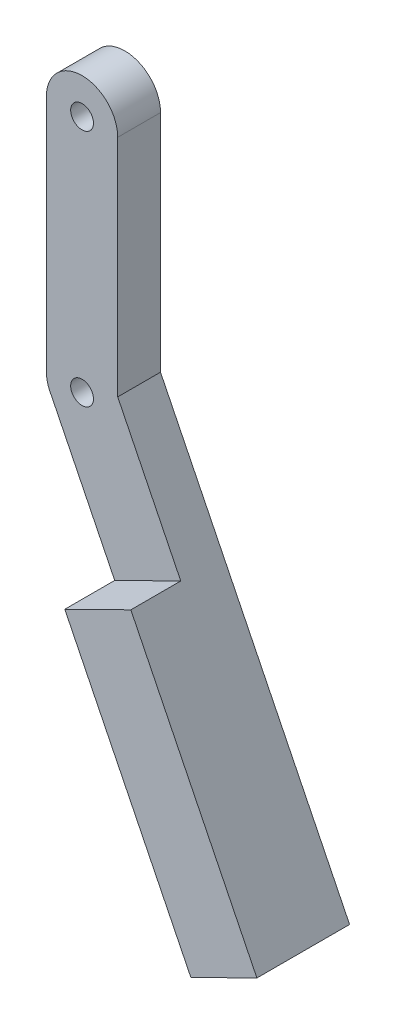
ISO-10303-21;
HEADER;
FILE_DESCRIPTION(('STEP AP214'),'2;1');
FILE_NAME('part.step','',(''),(''),'','','');
FILE_SCHEMA(('AUTOMOTIVE_DESIGN { 1 0 10303 214 1 1 1 1 }'));
ENDSEC;
DATA;
#1=APPLICATION_CONTEXT('core data for automotive mechanical design processes');
#2=APPLICATION_PROTOCOL_DEFINITION('international standard','automotive_design',2000,#1);
#3=PRODUCT_CONTEXT('',#1,'mechanical');
#4=PRODUCT('Part','Part','',(#3));
#5=PRODUCT_RELATED_PRODUCT_CATEGORY('part','',(#4));
#6=PRODUCT_DEFINITION_FORMATION('','',#4);
#7=PRODUCT_DEFINITION_CONTEXT('part definition',#1,'design');
#8=PRODUCT_DEFINITION('design','',#6,#7);
#9=PRODUCT_DEFINITION_SHAPE('','',#8);
#10=(LENGTH_UNIT() NAMED_UNIT(*) SI_UNIT(.MILLI.,.METRE.));
#11=(NAMED_UNIT(*) PLANE_ANGLE_UNIT() SI_UNIT($,.RADIAN.));
#12=(NAMED_UNIT(*) SI_UNIT($,.STERADIAN.) SOLID_ANGLE_UNIT());
#13=UNCERTAINTY_MEASURE_WITH_UNIT(LENGTH_MEASURE(1.E-05),#10,'distance_accuracy_value','');
#14=(GEOMETRIC_REPRESENTATION_CONTEXT(3) GLOBAL_UNCERTAINTY_ASSIGNED_CONTEXT((#13)) GLOBAL_UNIT_ASSIGNED_CONTEXT((#10,
#11,#12)) REPRESENTATION_CONTEXT('',''));
#15=CARTESIAN_POINT('',(0.,0.,0.));
#16=DIRECTION('',(0.,0.,1.));
#17=DIRECTION('',(1.,0.,0.));
#18=AXIS2_PLACEMENT_3D('',#15,#16,#17);
#19=CARTESIAN_POINT('',(0.,0.,6.));
#20=DIRECTION('',(0.,0.,1.));
#21=DIRECTION('',(1.,0.,0.));
#22=AXIS2_PLACEMENT_3D('',#19,#20,#21);
#23=PLANE('',#22);
#24=CARTESIAN_POINT('',(0.,33.48,6.));
#25=DIRECTION('',(0.,0.,1.));
#26=DIRECTION('',(1.,0.,0.));
#27=AXIS2_PLACEMENT_3D('',#24,#25,#26);
#28=CIRCLE('',#27,1.6);
#29=CARTESIAN_POINT('',(1.6,33.48,6.));
#30=VERTEX_POINT('',#29);
#31=EDGE_CURVE('E226',#30,#30,#28,.T.);
#32=ORIENTED_EDGE('',*,*,#31,.F.);
#33=EDGE_LOOP('',(#32));
#34=FACE_BOUND('',#33,.T.);
#35=CARTESIAN_POINT('',(0.,0.,6.));
#36=DIRECTION('',(0.,0.,1.));
#37=DIRECTION('',(1.,0.,0.));
#38=AXIS2_PLACEMENT_3D('',#35,#36,#37);
#39=CIRCLE('',#38,1.6);
#40=CARTESIAN_POINT('',(1.6,0.,6.));
#41=VERTEX_POINT('',#40);
#42=EDGE_CURVE('E220',#41,#41,#39,.T.);
#43=ORIENTED_EDGE('',*,*,#42,.F.);
#44=EDGE_LOOP('',(#43));
#45=FACE_BOUND('',#44,.T.);
#46=DIRECTION('',(0.44197559563337,-0.897027074766714,0.));
#47=VECTOR('',#46,1.);
#48=CARTESIAN_POINT('',(-4.46605794689399,-2.20047830967082,6.));
#49=LINE('',#48,#47);
#50=CARTESIAN_POINT('',(-4.26245075877173,-2.61371642093138,6.));
#51=VERTEX_POINT('',#50);
#52=CARTESIAN_POINT('',(4.57706115389571,-20.5542579162656,6.));
#53=VERTEX_POINT('',#52);
#54=EDGE_CURVE('E133',#51,#53,#49,.T.);
#55=ORIENTED_EDGE('',*,*,#54,.T.);
#56=DIRECTION('',(0.897027074766714,0.441975595633369,0.));
#57=VECTOR('',#56,1.);
#58=CARTESIAN_POINT('',(13.8395119126674,-15.9905414953343,6.));
#59=LINE('',#58,#57);
#60=CARTESIAN_POINT('',(13.8395119126674,-15.9905414953343,6.));
#61=VERTEX_POINT('',#60);
#62=EDGE_CURVE('E131',#53,#61,#59,.T.);
#63=ORIENTED_EDGE('',*,*,#62,.T.);
#64=DIRECTION('',(0.44197559563337,-0.897027074766714,0.));
#65=VECTOR('',#64,1.);
#66=CARTESIAN_POINT('',(4.79639281187774,2.36323811126056,6.));
#67=LINE('',#66,#65);
#68=CARTESIAN_POINT('',(5.,1.95,6.));
#69=VERTEX_POINT('',#68);
#70=EDGE_CURVE('E118',#69,#61,#67,.T.);
#71=ORIENTED_EDGE('',*,*,#70,.F.);
#72=DIRECTION('',(0.,-1.,0.));
#73=VECTOR('',#72,1.);
#74=CARTESIAN_POINT('',(5.,0.,6.));
#75=LINE('',#74,#73);
#76=CARTESIAN_POINT('',(5.,33.48,6.));
#77=VERTEX_POINT('',#76);
#78=EDGE_CURVE('E130',#77,#69,#75,.T.);
#79=ORIENTED_EDGE('',*,*,#78,.F.);
#80=CARTESIAN_POINT('',(0.,33.48,6.));
#81=DIRECTION('',(0.,0.,1.));
#82=DIRECTION('',(1.,0.,0.));
#83=AXIS2_PLACEMENT_3D('',#80,#81,#82);
#84=CIRCLE('',#83,5.);
#85=CARTESIAN_POINT('',(-5.,33.48,6.));
#86=VERTEX_POINT('',#85);
#87=EDGE_CURVE('E68',#77,#86,#84,.T.);
#88=ORIENTED_EDGE('',*,*,#87,.T.);
#89=DIRECTION('',(0.,-1.,0.));
#90=VECTOR('',#89,1.);
#91=CARTESIAN_POINT('',(-5.,0.,6.));
#92=LINE('',#91,#90);
#93=CARTESIAN_POINT('',(-5.,0.,6.));
#94=VERTEX_POINT('',#93);
#95=EDGE_CURVE('E166',#86,#94,#92,.T.);
#96=ORIENTED_EDGE('',*,*,#95,.T.);
#97=CARTESIAN_POINT('',(0.,0.,6.));
#98=DIRECTION('',(0.,0.,1.));
#99=DIRECTION('',(1.,0.,0.));
#100=AXIS2_PLACEMENT_3D('',#97,#98,#99);
#101=CIRCLE('',#100,5.);
#102=EDGE_CURVE('E106',#94,#51,#101,.T.);
#103=ORIENTED_EDGE('',*,*,#102,.T.);
#104=EDGE_LOOP('',(#55,#63,#71,#79,#88,#96,#103));
#105=FACE_BOUND('',#104,.T.);
#106=ADVANCED_FACE('F43',(#34,#45,#105),#23,.T.);
#107=CARTESIAN_POINT('',(-5.,0.,6.));
#108=DIRECTION('',(1.,0.,0.));
#109=DIRECTION('',(0.,1.,0.));
#110=AXIS2_PLACEMENT_3D('',#107,#108,#109);
#111=PLANE('',#110);
#112=DIRECTION('',(0.,-1.,0.));
#113=VECTOR('',#112,1.);
#114=CARTESIAN_POINT('',(-5.,0.,0.));
#115=LINE('',#114,#113);
#116=CARTESIAN_POINT('',(-5.,33.48,0.));
#117=VERTEX_POINT('',#116);
#118=CARTESIAN_POINT('',(-5.,0.,0.));
#119=VERTEX_POINT('',#118);
#120=EDGE_CURVE('E143',#117,#119,#115,.T.);
#121=ORIENTED_EDGE('',*,*,#120,.T.);
#122=DIRECTION('',(0.,0.,-1.));
#123=VECTOR('',#122,1.);
#124=CARTESIAN_POINT('',(-5.,0.,6.));
#125=LINE('',#124,#123);
#126=EDGE_CURVE('E11',#94,#119,#125,.T.);
#127=ORIENTED_EDGE('',*,*,#126,.F.);
#128=ORIENTED_EDGE('',*,*,#95,.F.);
#129=DIRECTION('',(0.,0.,-1.));
#130=VECTOR('',#129,1.);
#131=CARTESIAN_POINT('',(-5.,33.48,6.));
#132=LINE('',#131,#130);
#133=EDGE_CURVE('E139',#86,#117,#132,.T.);
#134=ORIENTED_EDGE('',*,*,#133,.T.);
#135=EDGE_LOOP('',(#121,#127,#128,#134));
#136=FACE_BOUND('',#135,.T.);
#137=ADVANCED_FACE('F45',(#136),#111,.F.);
#138=CARTESIAN_POINT('',(0.,0.,6.));
#139=DIRECTION('',(0.,0.,-1.));
#140=DIRECTION('',(-1.,0.,0.));
#141=AXIS2_PLACEMENT_3D('',#138,#139,#140);
#142=CYLINDRICAL_SURFACE('',#141,5.);
#143=CARTESIAN_POINT('',(0.,0.,0.));
#144=DIRECTION('',(0.,0.,1.));
#145=DIRECTION('',(1.,0.,0.));
#146=AXIS2_PLACEMENT_3D('',#143,#144,#145);
#147=CIRCLE('',#146,5.);
#148=CARTESIAN_POINT('',(-4.26245075877173,-2.61371642093138,0.));
#149=VERTEX_POINT('',#148);
#150=EDGE_CURVE('E147',#119,#149,#147,.T.);
#151=ORIENTED_EDGE('',*,*,#150,.T.);
#152=DIRECTION('',(0.,0.,-1.));
#153=VECTOR('',#152,1.);
#154=CARTESIAN_POINT('',(-4.26245075877173,-2.61371642093138,6.));
#155=LINE('',#154,#153);
#156=EDGE_CURVE('E52',#51,#149,#155,.T.);
#157=ORIENTED_EDGE('',*,*,#156,.F.);
#158=ORIENTED_EDGE('',*,*,#102,.F.);
#159=ORIENTED_EDGE('',*,*,#126,.T.);
#160=EDGE_LOOP('',(#151,#157,#158,#159));
#161=FACE_BOUND('',#160,.T.);
#162=ADVANCED_FACE('F263',(#161),#142,.T.);
#163=CARTESIAN_POINT('',(-4.46605794689399,-2.20047830967082,6.));
#164=DIRECTION('',(0.897027074766714,0.44197559563337,0.));
#165=DIRECTION('',(-0.44197559563337,0.897027074766714,0.));
#166=AXIS2_PLACEMENT_3D('',#163,#164,#165);
#167=PLANE('',#166);
#168=DIRECTION('',(0.44197559563337,-0.897027074766714,0.));
#169=VECTOR('',#168,1.);
#170=CARTESIAN_POINT('',(-4.46605794689399,-2.20047830967082,0.));
#171=LINE('',#170,#169);
#172=CARTESIAN_POINT('',(22.2560849792305,-56.4353409069342,0.));
#173=VERTEX_POINT('',#172);
#174=EDGE_CURVE('E151',#149,#173,#171,.T.);
#175=ORIENTED_EDGE('',*,*,#174,.T.);
#176=DIRECTION('',(0.,0.,-1.));
#177=VECTOR('',#176,1.);
#178=CARTESIAN_POINT('',(22.2560849792305,-56.4353409069342,6.));
#179=LINE('',#178,#177);
#180=CARTESIAN_POINT('',(22.2560849792305,-56.4353409069342,13.));
#181=VERTEX_POINT('',#180);
#182=EDGE_CURVE('E173',#181,#173,#179,.T.);
#183=ORIENTED_EDGE('',*,*,#182,.F.);
#184=DIRECTION('',(-0.441975595633369,0.897027074766714,0.));
#185=VECTOR('',#184,1.);
#186=CARTESIAN_POINT('',(22.2560849792305,-56.4353409069342,13.));
#187=LINE('',#186,#185);
#188=CARTESIAN_POINT('',(4.57706115389571,-20.5542579162656,13.));
#189=VERTEX_POINT('',#188);
#190=EDGE_CURVE('E198',#181,#189,#187,.T.);
#191=ORIENTED_EDGE('',*,*,#190,.T.);
#192=DIRECTION('',(0.,0.,-1.));
#193=VECTOR('',#192,1.);
#194=CARTESIAN_POINT('',(4.57706115389571,-20.5542579162656,13.));
#195=LINE('',#194,#193);
#196=EDGE_CURVE('E210',#189,#53,#195,.T.);
#197=ORIENTED_EDGE('',*,*,#196,.T.);
#198=ORIENTED_EDGE('',*,*,#54,.F.);
#199=ORIENTED_EDGE('',*,*,#156,.T.);
#200=EDGE_LOOP('',(#175,#183,#191,#197,#198,#199));
#201=FACE_BOUND('',#200,.T.);
#202=ADVANCED_FACE('F180',(#201),#167,.F.);
#203=CARTESIAN_POINT('',(26.7221429261244,-54.2348625972634,6.));
#204=DIRECTION('',(0.441975595633369,-0.897027074766714,0.));
#205=DIRECTION('',(0.897027074766714,0.441975595633369,0.));
#206=AXIS2_PLACEMENT_3D('',#203,#204,#205);
#207=PLANE('',#206);
#208=DIRECTION('',(-0.897027074766714,-0.441975595633369,0.));
#209=VECTOR('',#208,1.);
#210=CARTESIAN_POINT('',(26.7221429261244,-54.2348625972634,0.));
#211=LINE('',#210,#209);
#212=CARTESIAN_POINT('',(31.5185357380022,-51.8716244860028,0.));
#213=VERTEX_POINT('',#212);
#214=EDGE_CURVE('E155',#213,#173,#211,.T.);
#215=ORIENTED_EDGE('',*,*,#214,.F.);
#216=DIRECTION('',(0.,0.,-1.));
#217=VECTOR('',#216,1.);
#218=CARTESIAN_POINT('',(31.5185357380022,-51.8716244860028,6.));
#219=LINE('',#218,#217);
#220=CARTESIAN_POINT('',(31.5185357380022,-51.8716244860028,13.));
#221=VERTEX_POINT('',#220);
#222=EDGE_CURVE('E126',#221,#213,#219,.T.);
#223=ORIENTED_EDGE('',*,*,#222,.F.);
#224=DIRECTION('',(-0.897027074766714,-0.441975595633369,0.));
#225=VECTOR('',#224,1.);
#226=CARTESIAN_POINT('',(31.5185357380022,-51.8716244860028,13.));
#227=LINE('',#226,#225);
#228=EDGE_CURVE('E194',#221,#181,#227,.T.);
#229=ORIENTED_EDGE('',*,*,#228,.T.);
#230=ORIENTED_EDGE('',*,*,#182,.T.);
#231=EDGE_LOOP('',(#215,#223,#229,#230));
#232=FACE_BOUND('',#231,.T.);
#233=ADVANCED_FACE('F189',(#232),#207,.T.);
#234=CARTESIAN_POINT('',(4.79639281187774,2.36323811126056,6.));
#235=DIRECTION('',(0.897027074766714,0.44197559563337,0.));
#236=DIRECTION('',(-0.44197559563337,0.897027074766714,0.));
#237=AXIS2_PLACEMENT_3D('',#234,#235,#236);
#238=PLANE('',#237);
#239=DIRECTION('',(0.44197559563337,-0.897027074766714,0.));
#240=VECTOR('',#239,1.);
#241=CARTESIAN_POINT('',(4.79639281187774,2.36323811126056,0.));
#242=LINE('',#241,#240);
#243=CARTESIAN_POINT('',(5.,1.95,0.));
#244=VERTEX_POINT('',#243);
#245=EDGE_CURVE('E120',#244,#213,#242,.T.);
#246=ORIENTED_EDGE('',*,*,#245,.F.);
#247=DIRECTION('',(0.,0.,-1.));
#248=VECTOR('',#247,1.);
#249=CARTESIAN_POINT('',(5.,1.95,6.));
#250=LINE('',#249,#248);
#251=EDGE_CURVE('E115',#69,#244,#250,.T.);
#252=ORIENTED_EDGE('',*,*,#251,.F.);
#253=ORIENTED_EDGE('',*,*,#70,.T.);
#254=DIRECTION('',(0.,0.,-1.));
#255=VECTOR('',#254,1.);
#256=CARTESIAN_POINT('',(13.8395119126674,-15.9905414953343,13.));
#257=LINE('',#256,#255);
#258=CARTESIAN_POINT('',(13.8395119126674,-15.9905414953343,13.));
#259=VERTEX_POINT('',#258);
#260=EDGE_CURVE('E59',#259,#61,#257,.T.);
#261=ORIENTED_EDGE('',*,*,#260,.F.);
#262=DIRECTION('',(0.441975595633369,-0.897027074766715,0.));
#263=VECTOR('',#262,1.);
#264=CARTESIAN_POINT('',(31.5185357380022,-51.8716244860028,13.));
#265=LINE('',#264,#263);
#266=EDGE_CURVE('E212',#259,#221,#265,.T.);
#267=ORIENTED_EDGE('',*,*,#266,.T.);
#268=ORIENTED_EDGE('',*,*,#222,.T.);
#269=EDGE_LOOP('',(#246,#252,#253,#261,#267,#268));
#270=FACE_BOUND('',#269,.T.);
#271=ADVANCED_FACE('F117',(#270),#238,.T.);
#272=CARTESIAN_POINT('',(5.,0.,6.));
#273=DIRECTION('',(1.,0.,0.));
#274=DIRECTION('',(0.,1.,0.));
#275=AXIS2_PLACEMENT_3D('',#272,#273,#274);
#276=PLANE('',#275);
#277=DIRECTION('',(0.,-1.,0.));
#278=VECTOR('',#277,1.);
#279=CARTESIAN_POINT('',(5.,0.,0.));
#280=LINE('',#279,#278);
#281=CARTESIAN_POINT('',(5.,33.48,0.));
#282=VERTEX_POINT('',#281);
#283=EDGE_CURVE('E161',#282,#244,#280,.T.);
#284=ORIENTED_EDGE('',*,*,#283,.F.);
#285=DIRECTION('',(0.,0.,-1.));
#286=VECTOR('',#285,1.);
#287=CARTESIAN_POINT('',(5.,33.48,6.));
#288=LINE('',#287,#286);
#289=EDGE_CURVE('E127',#77,#282,#288,.T.);
#290=ORIENTED_EDGE('',*,*,#289,.F.);
#291=ORIENTED_EDGE('',*,*,#78,.T.);
#292=ORIENTED_EDGE('',*,*,#251,.T.);
#293=EDGE_LOOP('',(#284,#290,#291,#292));
#294=FACE_BOUND('',#293,.T.);
#295=ADVANCED_FACE('F135',(#294),#276,.T.);
#296=CARTESIAN_POINT('',(0.,33.48,6.));
#297=DIRECTION('',(0.,0.,-1.));
#298=DIRECTION('',(-1.,0.,0.));
#299=AXIS2_PLACEMENT_3D('',#296,#297,#298);
#300=CYLINDRICAL_SURFACE('',#299,5.);
#301=CARTESIAN_POINT('',(0.,33.48,0.));
#302=DIRECTION('',(0.,0.,1.));
#303=DIRECTION('',(1.,0.,0.));
#304=AXIS2_PLACEMENT_3D('',#301,#302,#303);
#305=CIRCLE('',#304,5.);
#306=EDGE_CURVE('E98',#282,#117,#305,.T.);
#307=ORIENTED_EDGE('',*,*,#306,.T.);
#308=ORIENTED_EDGE('',*,*,#133,.F.);
#309=ORIENTED_EDGE('',*,*,#87,.F.);
#310=ORIENTED_EDGE('',*,*,#289,.T.);
#311=EDGE_LOOP('',(#307,#308,#309,#310));
#312=FACE_BOUND('',#311,.T.);
#313=ADVANCED_FACE('F271',(#312),#300,.T.);
#314=CARTESIAN_POINT('',(0.,0.,0.));
#315=DIRECTION('',(0.,0.,1.));
#316=DIRECTION('',(1.,0.,0.));
#317=AXIS2_PLACEMENT_3D('',#314,#315,#316);
#318=PLANE('',#317);
#319=CARTESIAN_POINT('',(0.,33.48,0.));
#320=DIRECTION('',(0.,0.,1.));
#321=DIRECTION('',(1.,0.,0.));
#322=AXIS2_PLACEMENT_3D('',#319,#320,#321);
#323=CIRCLE('',#322,1.6);
#324=CARTESIAN_POINT('',(1.6,33.48,0.));
#325=VERTEX_POINT('',#324);
#326=EDGE_CURVE('E148',#325,#325,#323,.T.);
#327=ORIENTED_EDGE('',*,*,#326,.T.);
#328=EDGE_LOOP('',(#327));
#329=FACE_BOUND('',#328,.T.);
#330=CARTESIAN_POINT('',(0.,0.,0.));
#331=DIRECTION('',(0.,0.,1.));
#332=DIRECTION('',(1.,0.,0.));
#333=AXIS2_PLACEMENT_3D('',#330,#331,#332);
#334=CIRCLE('',#333,1.6);
#335=CARTESIAN_POINT('',(1.6,0.,0.));
#336=VERTEX_POINT('',#335);
#337=EDGE_CURVE('E230',#336,#336,#334,.T.);
#338=ORIENTED_EDGE('',*,*,#337,.T.);
#339=EDGE_LOOP('',(#338));
#340=FACE_BOUND('',#339,.T.);
#341=ORIENTED_EDGE('',*,*,#120,.F.);
#342=ORIENTED_EDGE('',*,*,#306,.F.);
#343=ORIENTED_EDGE('',*,*,#283,.T.);
#344=ORIENTED_EDGE('',*,*,#245,.T.);
#345=ORIENTED_EDGE('',*,*,#214,.T.);
#346=ORIENTED_EDGE('',*,*,#174,.F.);
#347=ORIENTED_EDGE('',*,*,#150,.F.);
#348=EDGE_LOOP('',(#341,#342,#343,#344,#345,#346,#347));
#349=FACE_BOUND('',#348,.T.);
#350=ADVANCED_FACE('F185',(#329,#340,#349),#318,.F.);
#351=CARTESIAN_POINT('',(0.,0.,0.));
#352=DIRECTION('',(0.,0.,1.));
#353=DIRECTION('',(1.,0.,0.));
#354=AXIS2_PLACEMENT_3D('',#351,#352,#353);
#355=CYLINDRICAL_SURFACE('',#354,1.6);
#356=ORIENTED_EDGE('',*,*,#337,.F.);
#357=EDGE_LOOP('',(#356));
#358=FACE_BOUND('',#357,.T.);
#359=ORIENTED_EDGE('',*,*,#42,.T.);
#360=EDGE_LOOP('',(#359));
#361=FACE_BOUND('',#360,.T.);
#362=ADVANCED_FACE('F254',(#358,#361),#355,.F.);
#363=CARTESIAN_POINT('',(0.,33.48,0.));
#364=DIRECTION('',(0.,0.,1.));
#365=DIRECTION('',(1.,0.,0.));
#366=AXIS2_PLACEMENT_3D('',#363,#364,#365);
#367=CYLINDRICAL_SURFACE('',#366,1.6);
#368=ORIENTED_EDGE('',*,*,#326,.F.);
#369=EDGE_LOOP('',(#368));
#370=FACE_BOUND('',#369,.T.);
#371=ORIENTED_EDGE('',*,*,#31,.T.);
#372=EDGE_LOOP('',(#371));
#373=FACE_BOUND('',#372,.T.);
#374=ADVANCED_FACE('F247',(#370,#373),#367,.F.);
#375=CARTESIAN_POINT('',(13.8395119126674,-15.9905414953343,13.));
#376=DIRECTION('',(-0.441975595633369,0.897027074766714,0.));
#377=DIRECTION('',(-0.897027074766714,-0.441975595633369,0.));
#378=AXIS2_PLACEMENT_3D('',#375,#376,#377);
#379=PLANE('',#378);
#380=ORIENTED_EDGE('',*,*,#62,.F.);
#381=ORIENTED_EDGE('',*,*,#196,.F.);
#382=DIRECTION('',(0.897027074766714,0.441975595633369,0.));
#383=VECTOR('',#382,1.);
#384=CARTESIAN_POINT('',(13.8395119126674,-15.9905414953343,13.));
#385=LINE('',#384,#383);
#386=EDGE_CURVE('E205',#189,#259,#385,.T.);
#387=ORIENTED_EDGE('',*,*,#386,.T.);
#388=ORIENTED_EDGE('',*,*,#260,.T.);
#389=EDGE_LOOP('',(#380,#381,#387,#388));
#390=FACE_BOUND('',#389,.T.);
#391=ADVANCED_FACE('F245',(#390),#379,.T.);
#392=CARTESIAN_POINT('',(0.,0.,13.));
#393=DIRECTION('',(0.,0.,1.));
#394=DIRECTION('',(1.,0.,0.));
#395=AXIS2_PLACEMENT_3D('',#392,#393,#394);
#396=PLANE('',#395);
#397=ORIENTED_EDGE('',*,*,#266,.F.);
#398=ORIENTED_EDGE('',*,*,#386,.F.);
#399=ORIENTED_EDGE('',*,*,#190,.F.);
#400=ORIENTED_EDGE('',*,*,#228,.F.);
#401=EDGE_LOOP('',(#397,#398,#399,#400));
#402=FACE_BOUND('',#401,.T.);
#403=ADVANCED_FACE('F203',(#402),#396,.T.);
#404=CLOSED_SHELL('',(#106,#137,#162,#202,#233,#271,#295,#313,#350,#362,#374,#391,#403));
#405=MANIFOLD_SOLID_BREP('B2',#404);
#406=ADVANCED_BREP_SHAPE_REPRESENTATION('',(#18,#405),#14);
#407=SHAPE_DEFINITION_REPRESENTATION(#9,#406);
ENDSEC;
END-ISO-10303-21;
